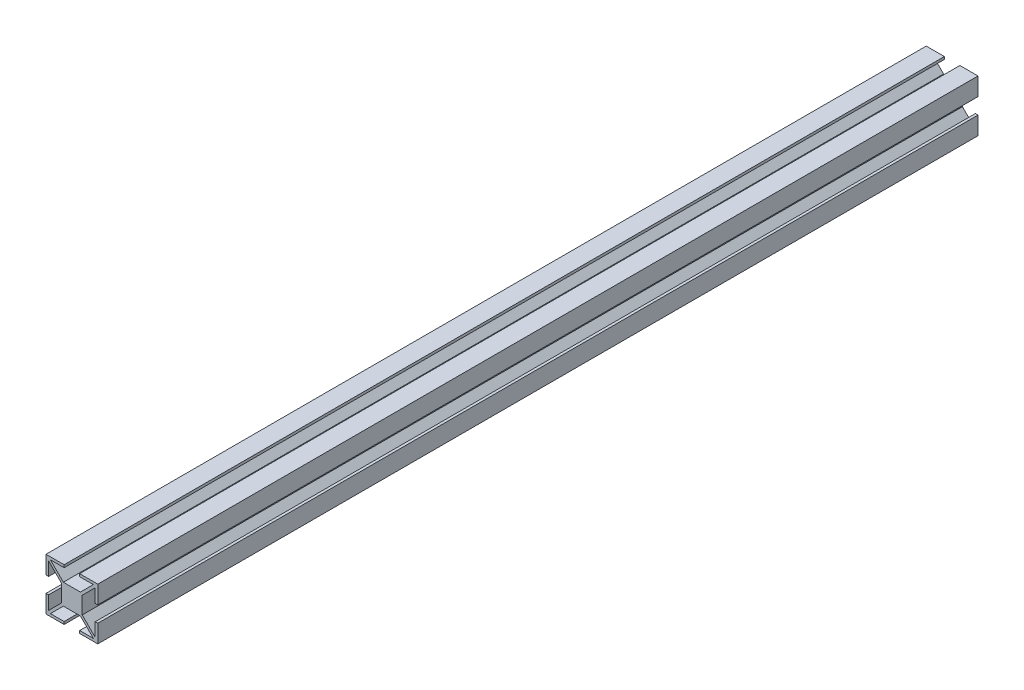
ISO-10303-21;
HEADER;
FILE_DESCRIPTION(('STEP AP214'),'2;1');
FILE_NAME('part.step','',(''),(''),'','','');
FILE_SCHEMA(('AUTOMOTIVE_DESIGN { 1 0 10303 214 1 1 1 1 }'));
ENDSEC;
DATA;
#1=APPLICATION_CONTEXT('core data for automotive mechanical design processes');
#2=APPLICATION_PROTOCOL_DEFINITION('international standard','automotive_design',2000,#1);
#3=PRODUCT_CONTEXT('',#1,'mechanical');
#4=PRODUCT('Part','Part','',(#3));
#5=PRODUCT_RELATED_PRODUCT_CATEGORY('part','',(#4));
#6=PRODUCT_DEFINITION_FORMATION('','',#4);
#7=PRODUCT_DEFINITION_CONTEXT('part definition',#1,'design');
#8=PRODUCT_DEFINITION('design','',#6,#7);
#9=PRODUCT_DEFINITION_SHAPE('','',#8);
#10=(LENGTH_UNIT() NAMED_UNIT(*) SI_UNIT(.MILLI.,.METRE.));
#11=(NAMED_UNIT(*) PLANE_ANGLE_UNIT() SI_UNIT($,.RADIAN.));
#12=(NAMED_UNIT(*) SI_UNIT($,.STERADIAN.) SOLID_ANGLE_UNIT());
#13=UNCERTAINTY_MEASURE_WITH_UNIT(LENGTH_MEASURE(1.E-05),#10,'distance_accuracy_value','');
#14=(GEOMETRIC_REPRESENTATION_CONTEXT(3) GLOBAL_UNCERTAINTY_ASSIGNED_CONTEXT((#13)) GLOBAL_UNIT_ASSIGNED_CONTEXT((#10,
#11,#12)) REPRESENTATION_CONTEXT('',''));
#15=CARTESIAN_POINT('',(0.,0.,0.));
#16=DIRECTION('',(0.,0.,1.));
#17=DIRECTION('',(1.,0.,0.));
#18=AXIS2_PLACEMENT_3D('',#15,#16,#17);
#19=CARTESIAN_POINT('',(10.,10.,340.));
#20=DIRECTION('',(0.,-1.,0.));
#21=DIRECTION('',(0.,0.,-1.));
#22=AXIS2_PLACEMENT_3D('',#19,#20,#21);
#23=PLANE('',#22);
#24=DIRECTION('',(-1.,0.,0.));
#25=VECTOR('',#24,1.);
#26=CARTESIAN_POINT('',(10.,10.,0.));
#27=LINE('',#26,#25);
#28=CARTESIAN_POINT('',(10.,10.,0.));
#29=VERTEX_POINT('',#28);
#30=CARTESIAN_POINT('',(3.,10.,0.));
#31=VERTEX_POINT('',#30);
#32=EDGE_CURVE('E299',#29,#31,#27,.T.);
#33=ORIENTED_EDGE('',*,*,#32,.T.);
#34=DIRECTION('',(0.,0.,-1.));
#35=VECTOR('',#34,1.);
#36=CARTESIAN_POINT('',(3.,10.,340.));
#37=LINE('',#36,#35);
#38=CARTESIAN_POINT('',(3.,10.,340.));
#39=VERTEX_POINT('',#38);
#40=EDGE_CURVE('E11',#39,#31,#37,.T.);
#41=ORIENTED_EDGE('',*,*,#40,.F.);
#42=DIRECTION('',(-1.,0.,0.));
#43=VECTOR('',#42,1.);
#44=CARTESIAN_POINT('',(10.,10.,340.));
#45=LINE('',#44,#43);
#46=CARTESIAN_POINT('',(10.,10.,340.));
#47=VERTEX_POINT('',#46);
#48=EDGE_CURVE('E369',#47,#39,#45,.T.);
#49=ORIENTED_EDGE('',*,*,#48,.F.);
#50=DIRECTION('',(0.,0.,-1.));
#51=VECTOR('',#50,1.);
#52=CARTESIAN_POINT('',(10.,10.,340.));
#53=LINE('',#52,#51);
#54=EDGE_CURVE('E295',#47,#29,#53,.T.);
#55=ORIENTED_EDGE('',*,*,#54,.T.);
#56=EDGE_LOOP('',(#33,#41,#49,#55));
#57=FACE_BOUND('',#56,.T.);
#58=ADVANCED_FACE('F35',(#57),#23,.F.);
#59=CARTESIAN_POINT('',(3.,10.,340.));
#60=DIRECTION('',(1.,0.,0.));
#61=DIRECTION('',(0.,0.,-1.));
#62=AXIS2_PLACEMENT_3D('',#59,#60,#61);
#63=PLANE('',#62);
#64=DIRECTION('',(0.,-1.,0.));
#65=VECTOR('',#64,1.);
#66=CARTESIAN_POINT('',(3.,10.,0.));
#67=LINE('',#66,#65);
#68=CARTESIAN_POINT('',(3.,9.,0.));
#69=VERTEX_POINT('',#68);
#70=EDGE_CURVE('E302',#31,#69,#67,.T.);
#71=ORIENTED_EDGE('',*,*,#70,.T.);
#72=DIRECTION('',(0.,0.,-1.));
#73=VECTOR('',#72,1.);
#74=CARTESIAN_POINT('',(3.,9.,340.));
#75=LINE('',#74,#73);
#76=CARTESIAN_POINT('',(3.,9.,340.));
#77=VERTEX_POINT('',#76);
#78=EDGE_CURVE('E43',#77,#69,#75,.T.);
#79=ORIENTED_EDGE('',*,*,#78,.F.);
#80=DIRECTION('',(0.,-1.,0.));
#81=VECTOR('',#80,1.);
#82=CARTESIAN_POINT('',(3.,10.,340.));
#83=LINE('',#82,#81);
#84=EDGE_CURVE('E178',#39,#77,#83,.T.);
#85=ORIENTED_EDGE('',*,*,#84,.F.);
#86=ORIENTED_EDGE('',*,*,#40,.T.);
#87=EDGE_LOOP('',(#71,#79,#85,#86));
#88=FACE_BOUND('',#87,.T.);
#89=ADVANCED_FACE('F567',(#88),#63,.F.);
#90=CARTESIAN_POINT('',(8.29289321881345,9.,340.));
#91=DIRECTION('',(0.,1.,0.));
#92=DIRECTION('',(0.,0.,1.));
#93=AXIS2_PLACEMENT_3D('',#90,#91,#92);
#94=PLANE('',#93);
#95=DIRECTION('',(1.,0.,0.));
#96=VECTOR('',#95,1.);
#97=CARTESIAN_POINT('',(8.29289321881345,9.,0.));
#98=LINE('',#97,#96);
#99=CARTESIAN_POINT('',(8.29289321881345,9.,0.));
#100=VERTEX_POINT('',#99);
#101=EDGE_CURVE('E304',#69,#100,#98,.T.);
#102=ORIENTED_EDGE('',*,*,#101,.T.);
#103=DIRECTION('',(0.,0.,-1.));
#104=VECTOR('',#103,1.);
#105=CARTESIAN_POINT('',(8.29289321881345,9.,340.));
#106=LINE('',#105,#104);
#107=CARTESIAN_POINT('',(8.29289321881345,9.,340.));
#108=VERTEX_POINT('',#107);
#109=EDGE_CURVE('E460',#108,#100,#106,.T.);
#110=ORIENTED_EDGE('',*,*,#109,.F.);
#111=DIRECTION('',(1.,0.,0.));
#112=VECTOR('',#111,1.);
#113=CARTESIAN_POINT('',(8.29289321881345,9.,340.));
#114=LINE('',#113,#112);
#115=EDGE_CURVE('E468',#77,#108,#114,.T.);
#116=ORIENTED_EDGE('',*,*,#115,.F.);
#117=ORIENTED_EDGE('',*,*,#78,.T.);
#118=EDGE_LOOP('',(#102,#110,#116,#117));
#119=FACE_BOUND('',#118,.T.);
#120=ADVANCED_FACE('F466',(#119),#94,.F.);
#121=CARTESIAN_POINT('',(8.29289321881345,9.,340.));
#122=DIRECTION('',(0.707106781186548,-0.707106781186547,0.));
#123=DIRECTION('',(0.707106781186547,0.707106781186548,0.));
#124=AXIS2_PLACEMENT_3D('',#121,#122,#123);
#125=PLANE('',#124);
#126=DIRECTION('',(-0.707106781186547,-0.707106781186548,0.));
#127=VECTOR('',#126,1.);
#128=CARTESIAN_POINT('',(8.29289321881345,9.,0.));
#129=LINE('',#128,#127);
#130=CARTESIAN_POINT('',(3.29289321881345,4.,0.));
#131=VERTEX_POINT('',#130);
#132=EDGE_CURVE('E306',#100,#131,#129,.T.);
#133=ORIENTED_EDGE('',*,*,#132,.T.);
#134=DIRECTION('',(0.,0.,-1.));
#135=VECTOR('',#134,1.);
#136=CARTESIAN_POINT('',(3.29289321881345,4.,340.));
#137=LINE('',#136,#135);
#138=CARTESIAN_POINT('',(3.29289321881345,4.,340.));
#139=VERTEX_POINT('',#138);
#140=EDGE_CURVE('E457',#139,#131,#137,.T.);
#141=ORIENTED_EDGE('',*,*,#140,.F.);
#142=DIRECTION('',(-0.707106781186547,-0.707106781186548,0.));
#143=VECTOR('',#142,1.);
#144=CARTESIAN_POINT('',(8.29289321881345,9.,340.));
#145=LINE('',#144,#143);
#146=EDGE_CURVE('E486',#108,#139,#145,.T.);
#147=ORIENTED_EDGE('',*,*,#146,.F.);
#148=ORIENTED_EDGE('',*,*,#109,.T.);
#149=EDGE_LOOP('',(#133,#141,#147,#148));
#150=FACE_BOUND('',#149,.T.);
#151=ADVANCED_FACE('F477',(#150),#125,.F.);
#152=CARTESIAN_POINT('',(-3.29289321881345,4.,340.));
#153=DIRECTION('',(0.,-1.,0.));
#154=DIRECTION('',(0.,0.,-1.));
#155=AXIS2_PLACEMENT_3D('',#152,#153,#154);
#156=PLANE('',#155);
#157=DIRECTION('',(-1.,0.,0.));
#158=VECTOR('',#157,1.);
#159=CARTESIAN_POINT('',(-3.29289321881345,4.,0.));
#160=LINE('',#159,#158);
#161=CARTESIAN_POINT('',(-3.29289321881345,4.,0.));
#162=VERTEX_POINT('',#161);
#163=EDGE_CURVE('E308',#131,#162,#160,.T.);
#164=ORIENTED_EDGE('',*,*,#163,.T.);
#165=DIRECTION('',(0.,0.,-1.));
#166=VECTOR('',#165,1.);
#167=CARTESIAN_POINT('',(-3.29289321881345,4.,340.));
#168=LINE('',#167,#166);
#169=CARTESIAN_POINT('',(-3.29289321881345,4.,340.));
#170=VERTEX_POINT('',#169);
#171=EDGE_CURVE('E454',#170,#162,#168,.T.);
#172=ORIENTED_EDGE('',*,*,#171,.F.);
#173=DIRECTION('',(-1.,0.,0.));
#174=VECTOR('',#173,1.);
#175=CARTESIAN_POINT('',(-3.29289321881345,4.,340.));
#176=LINE('',#175,#174);
#177=EDGE_CURVE('E483',#139,#170,#176,.T.);
#178=ORIENTED_EDGE('',*,*,#177,.F.);
#179=ORIENTED_EDGE('',*,*,#140,.T.);
#180=EDGE_LOOP('',(#164,#172,#178,#179));
#181=FACE_BOUND('',#180,.T.);
#182=ADVANCED_FACE('F481',(#181),#156,.F.);
#183=CARTESIAN_POINT('',(-8.29289321881345,9.,340.));
#184=DIRECTION('',(-0.707106781186548,-0.707106781186547,0.));
#185=DIRECTION('',(0.707106781186547,-0.707106781186548,0.));
#186=AXIS2_PLACEMENT_3D('',#183,#184,#185);
#187=PLANE('',#186);
#188=DIRECTION('',(-0.707106781186547,0.707106781186548,0.));
#189=VECTOR('',#188,1.);
#190=CARTESIAN_POINT('',(-8.29289321881345,9.,0.));
#191=LINE('',#190,#189);
#192=CARTESIAN_POINT('',(-8.29289321881345,9.,0.));
#193=VERTEX_POINT('',#192);
#194=EDGE_CURVE('E310',#162,#193,#191,.T.);
#195=ORIENTED_EDGE('',*,*,#194,.T.);
#196=DIRECTION('',(0.,0.,-1.));
#197=VECTOR('',#196,1.);
#198=CARTESIAN_POINT('',(-8.29289321881345,9.,340.));
#199=LINE('',#198,#197);
#200=CARTESIAN_POINT('',(-8.29289321881345,9.,340.));
#201=VERTEX_POINT('',#200);
#202=EDGE_CURVE('E451',#201,#193,#199,.T.);
#203=ORIENTED_EDGE('',*,*,#202,.F.);
#204=DIRECTION('',(-0.707106781186547,0.707106781186548,0.));
#205=VECTOR('',#204,1.);
#206=CARTESIAN_POINT('',(-8.29289321881345,9.,340.));
#207=LINE('',#206,#205);
#208=EDGE_CURVE('E485',#170,#201,#207,.T.);
#209=ORIENTED_EDGE('',*,*,#208,.F.);
#210=ORIENTED_EDGE('',*,*,#171,.T.);
#211=EDGE_LOOP('',(#195,#203,#209,#210));
#212=FACE_BOUND('',#211,.T.);
#213=ADVANCED_FACE('F580',(#212),#187,.F.);
#214=CARTESIAN_POINT('',(-8.29289321881345,9.,340.));
#215=DIRECTION('',(0.,1.,0.));
#216=DIRECTION('',(0.,0.,1.));
#217=AXIS2_PLACEMENT_3D('',#214,#215,#216);
#218=PLANE('',#217);
#219=DIRECTION('',(1.,0.,0.));
#220=VECTOR('',#219,1.);
#221=CARTESIAN_POINT('',(-8.29289321881345,9.,0.));
#222=LINE('',#221,#220);
#223=CARTESIAN_POINT('',(-3.,9.,0.));
#224=VERTEX_POINT('',#223);
#225=EDGE_CURVE('E312',#193,#224,#222,.T.);
#226=ORIENTED_EDGE('',*,*,#225,.T.);
#227=DIRECTION('',(0.,0.,-1.));
#228=VECTOR('',#227,1.);
#229=CARTESIAN_POINT('',(-3.,9.,340.));
#230=LINE('',#229,#228);
#231=CARTESIAN_POINT('',(-3.,9.,340.));
#232=VERTEX_POINT('',#231);
#233=EDGE_CURVE('E448',#232,#224,#230,.T.);
#234=ORIENTED_EDGE('',*,*,#233,.F.);
#235=DIRECTION('',(1.,0.,0.));
#236=VECTOR('',#235,1.);
#237=CARTESIAN_POINT('',(-8.29289321881345,9.,340.));
#238=LINE('',#237,#236);
#239=EDGE_CURVE('E488',#201,#232,#238,.T.);
#240=ORIENTED_EDGE('',*,*,#239,.F.);
#241=ORIENTED_EDGE('',*,*,#202,.T.);
#242=EDGE_LOOP('',(#226,#234,#240,#241));
#243=FACE_BOUND('',#242,.T.);
#244=ADVANCED_FACE('F583',(#243),#218,.F.);
#245=CARTESIAN_POINT('',(-3.,10.,340.));
#246=DIRECTION('',(-1.,0.,0.));
#247=DIRECTION('',(0.,0.,1.));
#248=AXIS2_PLACEMENT_3D('',#245,#246,#247);
#249=PLANE('',#248);
#250=DIRECTION('',(0.,1.,0.));
#251=VECTOR('',#250,1.);
#252=CARTESIAN_POINT('',(-3.,10.,0.));
#253=LINE('',#252,#251);
#254=CARTESIAN_POINT('',(-3.,10.,0.));
#255=VERTEX_POINT('',#254);
#256=EDGE_CURVE('E314',#224,#255,#253,.T.);
#257=ORIENTED_EDGE('',*,*,#256,.T.);
#258=DIRECTION('',(0.,0.,-1.));
#259=VECTOR('',#258,1.);
#260=CARTESIAN_POINT('',(-3.,10.,340.));
#261=LINE('',#260,#259);
#262=CARTESIAN_POINT('',(-3.,10.,340.));
#263=VERTEX_POINT('',#262);
#264=EDGE_CURVE('E445',#263,#255,#261,.T.);
#265=ORIENTED_EDGE('',*,*,#264,.F.);
#266=DIRECTION('',(0.,1.,0.));
#267=VECTOR('',#266,1.);
#268=CARTESIAN_POINT('',(-3.,10.,340.));
#269=LINE('',#268,#267);
#270=EDGE_CURVE('E494',#232,#263,#269,.T.);
#271=ORIENTED_EDGE('',*,*,#270,.F.);
#272=ORIENTED_EDGE('',*,*,#233,.T.);
#273=EDGE_LOOP('',(#257,#265,#271,#272));
#274=FACE_BOUND('',#273,.T.);
#275=ADVANCED_FACE('F587',(#274),#249,.F.);
#276=CARTESIAN_POINT('',(-10.,10.,340.));
#277=DIRECTION('',(0.,-1.,0.));
#278=DIRECTION('',(0.,0.,-1.));
#279=AXIS2_PLACEMENT_3D('',#276,#277,#278);
#280=PLANE('',#279);
#281=DIRECTION('',(-1.,0.,0.));
#282=VECTOR('',#281,1.);
#283=CARTESIAN_POINT('',(-10.,10.,0.));
#284=LINE('',#283,#282);
#285=CARTESIAN_POINT('',(-10.,10.,0.));
#286=VERTEX_POINT('',#285);
#287=EDGE_CURVE('E316',#255,#286,#284,.T.);
#288=ORIENTED_EDGE('',*,*,#287,.T.);
#289=DIRECTION('',(0.,0.,-1.));
#290=VECTOR('',#289,1.);
#291=CARTESIAN_POINT('',(-10.,10.,340.));
#292=LINE('',#291,#290);
#293=CARTESIAN_POINT('',(-10.,10.,340.));
#294=VERTEX_POINT('',#293);
#295=EDGE_CURVE('E442',#294,#286,#292,.T.);
#296=ORIENTED_EDGE('',*,*,#295,.F.);
#297=DIRECTION('',(-1.,0.,0.));
#298=VECTOR('',#297,1.);
#299=CARTESIAN_POINT('',(-10.,10.,340.));
#300=LINE('',#299,#298);
#301=EDGE_CURVE('E496',#263,#294,#300,.T.);
#302=ORIENTED_EDGE('',*,*,#301,.F.);
#303=ORIENTED_EDGE('',*,*,#264,.T.);
#304=EDGE_LOOP('',(#288,#296,#302,#303));
#305=FACE_BOUND('',#304,.T.);
#306=ADVANCED_FACE('F591',(#305),#280,.F.);
#307=CARTESIAN_POINT('',(-10.,10.,340.));
#308=DIRECTION('',(1.,0.,0.));
#309=DIRECTION('',(0.,0.,-1.));
#310=AXIS2_PLACEMENT_3D('',#307,#308,#309);
#311=PLANE('',#310);
#312=DIRECTION('',(0.,-1.,0.));
#313=VECTOR('',#312,1.);
#314=CARTESIAN_POINT('',(-10.,10.,0.));
#315=LINE('',#314,#313);
#316=CARTESIAN_POINT('',(-10.,3.07404458598726,0.));
#317=VERTEX_POINT('',#316);
#318=EDGE_CURVE('E318',#286,#317,#315,.T.);
#319=ORIENTED_EDGE('',*,*,#318,.T.);
#320=DIRECTION('',(0.,0.,-1.));
#321=VECTOR('',#320,1.);
#322=CARTESIAN_POINT('',(-10.,3.07404458598726,340.));
#323=LINE('',#322,#321);
#324=CARTESIAN_POINT('',(-10.,3.07404458598726,340.));
#325=VERTEX_POINT('',#324);
#326=EDGE_CURVE('E439',#325,#317,#323,.T.);
#327=ORIENTED_EDGE('',*,*,#326,.F.);
#328=DIRECTION('',(0.,-1.,0.));
#329=VECTOR('',#328,1.);
#330=CARTESIAN_POINT('',(-10.,10.,340.));
#331=LINE('',#330,#329);
#332=EDGE_CURVE('E498',#294,#325,#331,.T.);
#333=ORIENTED_EDGE('',*,*,#332,.F.);
#334=ORIENTED_EDGE('',*,*,#295,.T.);
#335=EDGE_LOOP('',(#319,#327,#333,#334));
#336=FACE_BOUND('',#335,.T.);
#337=ADVANCED_FACE('F595',(#336),#311,.F.);
#338=CARTESIAN_POINT('',(-10.,3.07404458598726,340.));
#339=DIRECTION('',(0.,1.,0.));
#340=DIRECTION('',(0.,0.,1.));
#341=AXIS2_PLACEMENT_3D('',#338,#339,#340);
#342=PLANE('',#341);
#343=DIRECTION('',(1.,0.,0.));
#344=VECTOR('',#343,1.);
#345=CARTESIAN_POINT('',(-10.,3.07404458598726,0.));
#346=LINE('',#345,#344);
#347=CARTESIAN_POINT('',(-9.,3.07404458598726,0.));
#348=VERTEX_POINT('',#347);
#349=EDGE_CURVE('E320',#317,#348,#346,.T.);
#350=ORIENTED_EDGE('',*,*,#349,.T.);
#351=DIRECTION('',(0.,0.,-1.));
#352=VECTOR('',#351,1.);
#353=CARTESIAN_POINT('',(-9.,3.07404458598726,340.));
#354=LINE('',#353,#352);
#355=CARTESIAN_POINT('',(-9.,3.07404458598726,340.));
#356=VERTEX_POINT('',#355);
#357=EDGE_CURVE('E436',#356,#348,#354,.T.);
#358=ORIENTED_EDGE('',*,*,#357,.F.);
#359=DIRECTION('',(1.,0.,0.));
#360=VECTOR('',#359,1.);
#361=CARTESIAN_POINT('',(-10.,3.07404458598726,340.));
#362=LINE('',#361,#360);
#363=EDGE_CURVE('E500',#325,#356,#362,.T.);
#364=ORIENTED_EDGE('',*,*,#363,.F.);
#365=ORIENTED_EDGE('',*,*,#326,.T.);
#366=EDGE_LOOP('',(#350,#358,#364,#365));
#367=FACE_BOUND('',#366,.T.);
#368=ADVANCED_FACE('F599',(#367),#342,.F.);
#369=CARTESIAN_POINT('',(-9.,8.29289321881345,340.));
#370=DIRECTION('',(-1.,0.,0.));
#371=DIRECTION('',(0.,0.,1.));
#372=AXIS2_PLACEMENT_3D('',#369,#370,#371);
#373=PLANE('',#372);
#374=DIRECTION('',(0.,1.,0.));
#375=VECTOR('',#374,1.);
#376=CARTESIAN_POINT('',(-9.,8.29289321881345,0.));
#377=LINE('',#376,#375);
#378=CARTESIAN_POINT('',(-9.,8.29289321881345,0.));
#379=VERTEX_POINT('',#378);
#380=EDGE_CURVE('E322',#348,#379,#377,.T.);
#381=ORIENTED_EDGE('',*,*,#380,.T.);
#382=DIRECTION('',(0.,0.,-1.));
#383=VECTOR('',#382,1.);
#384=CARTESIAN_POINT('',(-9.,8.29289321881345,340.));
#385=LINE('',#384,#383);
#386=CARTESIAN_POINT('',(-9.,8.29289321881345,340.));
#387=VERTEX_POINT('',#386);
#388=EDGE_CURVE('E433',#387,#379,#385,.T.);
#389=ORIENTED_EDGE('',*,*,#388,.F.);
#390=DIRECTION('',(0.,1.,0.));
#391=VECTOR('',#390,1.);
#392=CARTESIAN_POINT('',(-9.,8.29289321881345,340.));
#393=LINE('',#392,#391);
#394=EDGE_CURVE('E502',#356,#387,#393,.T.);
#395=ORIENTED_EDGE('',*,*,#394,.F.);
#396=ORIENTED_EDGE('',*,*,#357,.T.);
#397=EDGE_LOOP('',(#381,#389,#395,#396));
#398=FACE_BOUND('',#397,.T.);
#399=ADVANCED_FACE('F603',(#398),#373,.F.);
#400=CARTESIAN_POINT('',(-9.,8.29289321881345,340.));
#401=DIRECTION('',(0.707106781186547,0.707106781186547,0.));
#402=DIRECTION('',(-0.707106781186548,0.707106781186548,0.));
#403=AXIS2_PLACEMENT_3D('',#400,#401,#402);
#404=PLANE('',#403);
#405=DIRECTION('',(0.707106781186547,-0.707106781186547,0.));
#406=VECTOR('',#405,1.);
#407=CARTESIAN_POINT('',(-9.,8.29289321881345,0.));
#408=LINE('',#407,#406);
#409=CARTESIAN_POINT('',(-4.,3.29289321881345,0.));
#410=VERTEX_POINT('',#409);
#411=EDGE_CURVE('E324',#379,#410,#408,.T.);
#412=ORIENTED_EDGE('',*,*,#411,.T.);
#413=DIRECTION('',(0.,0.,-1.));
#414=VECTOR('',#413,1.);
#415=CARTESIAN_POINT('',(-4.,3.29289321881345,340.));
#416=LINE('',#415,#414);
#417=CARTESIAN_POINT('',(-4.,3.29289321881345,340.));
#418=VERTEX_POINT('',#417);
#419=EDGE_CURVE('E430',#418,#410,#416,.T.);
#420=ORIENTED_EDGE('',*,*,#419,.F.);
#421=DIRECTION('',(0.707106781186547,-0.707106781186547,0.));
#422=VECTOR('',#421,1.);
#423=CARTESIAN_POINT('',(-9.,8.29289321881345,340.));
#424=LINE('',#423,#422);
#425=EDGE_CURVE('E504',#387,#418,#424,.T.);
#426=ORIENTED_EDGE('',*,*,#425,.F.);
#427=ORIENTED_EDGE('',*,*,#388,.T.);
#428=EDGE_LOOP('',(#412,#420,#426,#427));
#429=FACE_BOUND('',#428,.T.);
#430=ADVANCED_FACE('F607',(#429),#404,.F.);
#431=CARTESIAN_POINT('',(-4.,-3.29289321881345,340.));
#432=DIRECTION('',(1.,0.,0.));
#433=DIRECTION('',(0.,0.,-1.));
#434=AXIS2_PLACEMENT_3D('',#431,#432,#433);
#435=PLANE('',#434);
#436=DIRECTION('',(0.,-1.,0.));
#437=VECTOR('',#436,1.);
#438=CARTESIAN_POINT('',(-4.,-3.29289321881345,0.));
#439=LINE('',#438,#437);
#440=CARTESIAN_POINT('',(-4.,-3.29289321881345,0.));
#441=VERTEX_POINT('',#440);
#442=EDGE_CURVE('E326',#410,#441,#439,.T.);
#443=ORIENTED_EDGE('',*,*,#442,.T.);
#444=DIRECTION('',(0.,0.,-1.));
#445=VECTOR('',#444,1.);
#446=CARTESIAN_POINT('',(-4.,-3.29289321881345,340.));
#447=LINE('',#446,#445);
#448=CARTESIAN_POINT('',(-4.,-3.29289321881345,340.));
#449=VERTEX_POINT('',#448);
#450=EDGE_CURVE('E427',#449,#441,#447,.T.);
#451=ORIENTED_EDGE('',*,*,#450,.F.);
#452=DIRECTION('',(0.,-1.,0.));
#453=VECTOR('',#452,1.);
#454=CARTESIAN_POINT('',(-4.,-3.29289321881345,340.));
#455=LINE('',#454,#453);
#456=EDGE_CURVE('E506',#418,#449,#455,.T.);
#457=ORIENTED_EDGE('',*,*,#456,.F.);
#458=ORIENTED_EDGE('',*,*,#419,.T.);
#459=EDGE_LOOP('',(#443,#451,#457,#458));
#460=FACE_BOUND('',#459,.T.);
#461=ADVANCED_FACE('F611',(#460),#435,.F.);
#462=CARTESIAN_POINT('',(-9.,-8.29289321881345,340.));
#463=DIRECTION('',(0.707106781186547,-0.707106781186547,0.));
#464=DIRECTION('',(0.707106781186548,0.707106781186548,0.));
#465=AXIS2_PLACEMENT_3D('',#462,#463,#464);
#466=PLANE('',#465);
#467=DIRECTION('',(-0.707106781186547,-0.707106781186547,0.));
#468=VECTOR('',#467,1.);
#469=CARTESIAN_POINT('',(-9.,-8.29289321881345,0.));
#470=LINE('',#469,#468);
#471=CARTESIAN_POINT('',(-9.,-8.29289321881345,0.));
#472=VERTEX_POINT('',#471);
#473=EDGE_CURVE('E328',#441,#472,#470,.T.);
#474=ORIENTED_EDGE('',*,*,#473,.T.);
#475=DIRECTION('',(0.,0.,-1.));
#476=VECTOR('',#475,1.);
#477=CARTESIAN_POINT('',(-9.,-8.29289321881345,340.));
#478=LINE('',#477,#476);
#479=CARTESIAN_POINT('',(-9.,-8.29289321881345,340.));
#480=VERTEX_POINT('',#479);
#481=EDGE_CURVE('E424',#480,#472,#478,.T.);
#482=ORIENTED_EDGE('',*,*,#481,.F.);
#483=DIRECTION('',(-0.707106781186547,-0.707106781186547,0.));
#484=VECTOR('',#483,1.);
#485=CARTESIAN_POINT('',(-9.,-8.29289321881345,340.));
#486=LINE('',#485,#484);
#487=EDGE_CURVE('E508',#449,#480,#486,.T.);
#488=ORIENTED_EDGE('',*,*,#487,.F.);
#489=ORIENTED_EDGE('',*,*,#450,.T.);
#490=EDGE_LOOP('',(#474,#482,#488,#489));
#491=FACE_BOUND('',#490,.T.);
#492=ADVANCED_FACE('F615',(#491),#466,.F.);
#493=CARTESIAN_POINT('',(-9.,-8.29289321881345,340.));
#494=DIRECTION('',(-1.,0.,0.));
#495=DIRECTION('',(0.,0.,1.));
#496=AXIS2_PLACEMENT_3D('',#493,#494,#495);
#497=PLANE('',#496);
#498=DIRECTION('',(0.,1.,0.));
#499=VECTOR('',#498,1.);
#500=CARTESIAN_POINT('',(-9.,-8.29289321881345,0.));
#501=LINE('',#500,#499);
#502=CARTESIAN_POINT('',(-9.,-3.07404458598726,0.));
#503=VERTEX_POINT('',#502);
#504=EDGE_CURVE('E330',#472,#503,#501,.T.);
#505=ORIENTED_EDGE('',*,*,#504,.T.);
#506=DIRECTION('',(0.,0.,-1.));
#507=VECTOR('',#506,1.);
#508=CARTESIAN_POINT('',(-9.,-3.07404458598726,340.));
#509=LINE('',#508,#507);
#510=CARTESIAN_POINT('',(-9.,-3.07404458598726,340.));
#511=VERTEX_POINT('',#510);
#512=EDGE_CURVE('E421',#511,#503,#509,.T.);
#513=ORIENTED_EDGE('',*,*,#512,.F.);
#514=DIRECTION('',(0.,1.,0.));
#515=VECTOR('',#514,1.);
#516=CARTESIAN_POINT('',(-9.,-8.29289321881345,340.));
#517=LINE('',#516,#515);
#518=EDGE_CURVE('E510',#480,#511,#517,.T.);
#519=ORIENTED_EDGE('',*,*,#518,.F.);
#520=ORIENTED_EDGE('',*,*,#481,.T.);
#521=EDGE_LOOP('',(#505,#513,#519,#520));
#522=FACE_BOUND('',#521,.T.);
#523=ADVANCED_FACE('F619',(#522),#497,.F.);
#524=CARTESIAN_POINT('',(-10.,-3.07404458598726,340.));
#525=DIRECTION('',(0.,-1.,0.));
#526=DIRECTION('',(0.,0.,-1.));
#527=AXIS2_PLACEMENT_3D('',#524,#525,#526);
#528=PLANE('',#527);
#529=DIRECTION('',(-1.,0.,0.));
#530=VECTOR('',#529,1.);
#531=CARTESIAN_POINT('',(-10.,-3.07404458598726,0.));
#532=LINE('',#531,#530);
#533=CARTESIAN_POINT('',(-10.,-3.07404458598726,0.));
#534=VERTEX_POINT('',#533);
#535=EDGE_CURVE('E332',#503,#534,#532,.T.);
#536=ORIENTED_EDGE('',*,*,#535,.T.);
#537=DIRECTION('',(0.,0.,-1.));
#538=VECTOR('',#537,1.);
#539=CARTESIAN_POINT('',(-10.,-3.07404458598726,340.));
#540=LINE('',#539,#538);
#541=CARTESIAN_POINT('',(-10.,-3.07404458598726,340.));
#542=VERTEX_POINT('',#541);
#543=EDGE_CURVE('E418',#542,#534,#540,.T.);
#544=ORIENTED_EDGE('',*,*,#543,.F.);
#545=DIRECTION('',(-1.,0.,0.));
#546=VECTOR('',#545,1.);
#547=CARTESIAN_POINT('',(-10.,-3.07404458598726,340.));
#548=LINE('',#547,#546);
#549=EDGE_CURVE('E512',#511,#542,#548,.T.);
#550=ORIENTED_EDGE('',*,*,#549,.F.);
#551=ORIENTED_EDGE('',*,*,#512,.T.);
#552=EDGE_LOOP('',(#536,#544,#550,#551));
#553=FACE_BOUND('',#552,.T.);
#554=ADVANCED_FACE('F623',(#553),#528,.F.);
#555=CARTESIAN_POINT('',(-10.,-10.,340.));
#556=DIRECTION('',(1.,0.,0.));
#557=DIRECTION('',(0.,0.,-1.));
#558=AXIS2_PLACEMENT_3D('',#555,#556,#557);
#559=PLANE('',#558);
#560=DIRECTION('',(0.,-1.,0.));
#561=VECTOR('',#560,1.);
#562=CARTESIAN_POINT('',(-10.,-10.,0.));
#563=LINE('',#562,#561);
#564=CARTESIAN_POINT('',(-10.,-10.,0.));
#565=VERTEX_POINT('',#564);
#566=EDGE_CURVE('E334',#534,#565,#563,.T.);
#567=ORIENTED_EDGE('',*,*,#566,.T.);
#568=DIRECTION('',(0.,0.,-1.));
#569=VECTOR('',#568,1.);
#570=CARTESIAN_POINT('',(-10.,-10.,340.));
#571=LINE('',#570,#569);
#572=CARTESIAN_POINT('',(-10.,-10.,340.));
#573=VERTEX_POINT('',#572);
#574=EDGE_CURVE('E415',#573,#565,#571,.T.);
#575=ORIENTED_EDGE('',*,*,#574,.F.);
#576=DIRECTION('',(0.,-1.,0.));
#577=VECTOR('',#576,1.);
#578=CARTESIAN_POINT('',(-10.,-10.,340.));
#579=LINE('',#578,#577);
#580=EDGE_CURVE('E514',#542,#573,#579,.T.);
#581=ORIENTED_EDGE('',*,*,#580,.F.);
#582=ORIENTED_EDGE('',*,*,#543,.T.);
#583=EDGE_LOOP('',(#567,#575,#581,#582));
#584=FACE_BOUND('',#583,.T.);
#585=ADVANCED_FACE('F627',(#584),#559,.F.);
#586=CARTESIAN_POINT('',(-10.,-10.,340.));
#587=DIRECTION('',(0.,1.,0.));
#588=DIRECTION('',(-1.,0.,0.));
#589=AXIS2_PLACEMENT_3D('',#586,#587,#588);
#590=PLANE('',#589);
#591=DIRECTION('',(1.,0.,0.));
#592=VECTOR('',#591,1.);
#593=CARTESIAN_POINT('',(-10.,-10.,0.));
#594=LINE('',#593,#592);
#595=CARTESIAN_POINT('',(-3.,-10.,0.));
#596=VERTEX_POINT('',#595);
#597=EDGE_CURVE('E336',#565,#596,#594,.T.);
#598=ORIENTED_EDGE('',*,*,#597,.T.);
#599=DIRECTION('',(0.,0.,-1.));
#600=VECTOR('',#599,1.);
#601=CARTESIAN_POINT('',(-3.,-10.,340.));
#602=LINE('',#601,#600);
#603=CARTESIAN_POINT('',(-3.,-10.,340.));
#604=VERTEX_POINT('',#603);
#605=EDGE_CURVE('E412',#604,#596,#602,.T.);
#606=ORIENTED_EDGE('',*,*,#605,.F.);
#607=DIRECTION('',(1.,0.,0.));
#608=VECTOR('',#607,1.);
#609=CARTESIAN_POINT('',(-10.,-10.,340.));
#610=LINE('',#609,#608);
#611=EDGE_CURVE('E516',#573,#604,#610,.T.);
#612=ORIENTED_EDGE('',*,*,#611,.F.);
#613=ORIENTED_EDGE('',*,*,#574,.T.);
#614=EDGE_LOOP('',(#598,#606,#612,#613));
#615=FACE_BOUND('',#614,.T.);
#616=ADVANCED_FACE('F631',(#615),#590,.F.);
#617=CARTESIAN_POINT('',(-3.,-10.,340.));
#618=DIRECTION('',(-1.,0.,0.));
#619=DIRECTION('',(0.,0.,1.));
#620=AXIS2_PLACEMENT_3D('',#617,#618,#619);
#621=PLANE('',#620);
#622=DIRECTION('',(0.,1.,0.));
#623=VECTOR('',#622,1.);
#624=CARTESIAN_POINT('',(-3.,-10.,0.));
#625=LINE('',#624,#623);
#626=CARTESIAN_POINT('',(-3.,-9.,0.));
#627=VERTEX_POINT('',#626);
#628=EDGE_CURVE('E338',#596,#627,#625,.T.);
#629=ORIENTED_EDGE('',*,*,#628,.T.);
#630=DIRECTION('',(0.,0.,-1.));
#631=VECTOR('',#630,1.);
#632=CARTESIAN_POINT('',(-3.,-9.,340.));
#633=LINE('',#632,#631);
#634=CARTESIAN_POINT('',(-3.,-9.,340.));
#635=VERTEX_POINT('',#634);
#636=EDGE_CURVE('E409',#635,#627,#633,.T.);
#637=ORIENTED_EDGE('',*,*,#636,.F.);
#638=DIRECTION('',(0.,1.,0.));
#639=VECTOR('',#638,1.);
#640=CARTESIAN_POINT('',(-3.,-10.,340.));
#641=LINE('',#640,#639);
#642=EDGE_CURVE('E518',#604,#635,#641,.T.);
#643=ORIENTED_EDGE('',*,*,#642,.F.);
#644=ORIENTED_EDGE('',*,*,#605,.T.);
#645=EDGE_LOOP('',(#629,#637,#643,#644));
#646=FACE_BOUND('',#645,.T.);
#647=ADVANCED_FACE('F635',(#646),#621,.F.);
#648=CARTESIAN_POINT('',(-8.29289321881345,-9.,340.));
#649=DIRECTION('',(0.,-1.,0.));
#650=DIRECTION('',(0.,0.,-1.));
#651=AXIS2_PLACEMENT_3D('',#648,#649,#650);
#652=PLANE('',#651);
#653=DIRECTION('',(-1.,0.,0.));
#654=VECTOR('',#653,1.);
#655=CARTESIAN_POINT('',(-8.29289321881345,-9.,0.));
#656=LINE('',#655,#654);
#657=CARTESIAN_POINT('',(-8.29289321881345,-9.,0.));
#658=VERTEX_POINT('',#657);
#659=EDGE_CURVE('E340',#627,#658,#656,.T.);
#660=ORIENTED_EDGE('',*,*,#659,.T.);
#661=DIRECTION('',(0.,0.,-1.));
#662=VECTOR('',#661,1.);
#663=CARTESIAN_POINT('',(-8.29289321881345,-9.,340.));
#664=LINE('',#663,#662);
#665=CARTESIAN_POINT('',(-8.29289321881345,-9.,340.));
#666=VERTEX_POINT('',#665);
#667=EDGE_CURVE('E406',#666,#658,#664,.T.);
#668=ORIENTED_EDGE('',*,*,#667,.F.);
#669=DIRECTION('',(-1.,0.,0.));
#670=VECTOR('',#669,1.);
#671=CARTESIAN_POINT('',(-8.29289321881345,-9.,340.));
#672=LINE('',#671,#670);
#673=EDGE_CURVE('E520',#635,#666,#672,.T.);
#674=ORIENTED_EDGE('',*,*,#673,.F.);
#675=ORIENTED_EDGE('',*,*,#636,.T.);
#676=EDGE_LOOP('',(#660,#668,#674,#675));
#677=FACE_BOUND('',#676,.T.);
#678=ADVANCED_FACE('F639',(#677),#652,.F.);
#679=CARTESIAN_POINT('',(-8.29289321881345,-9.,340.));
#680=DIRECTION('',(-0.707106781186548,0.707106781186547,0.));
#681=DIRECTION('',(-0.707106781186547,-0.707106781186548,0.));
#682=AXIS2_PLACEMENT_3D('',#679,#680,#681);
#683=PLANE('',#682);
#684=DIRECTION('',(0.707106781186547,0.707106781186548,0.));
#685=VECTOR('',#684,1.);
#686=CARTESIAN_POINT('',(-8.29289321881345,-9.,0.));
#687=LINE('',#686,#685);
#688=CARTESIAN_POINT('',(-3.29289321881345,-4.,0.));
#689=VERTEX_POINT('',#688);
#690=EDGE_CURVE('E342',#658,#689,#687,.T.);
#691=ORIENTED_EDGE('',*,*,#690,.T.);
#692=DIRECTION('',(0.,0.,-1.));
#693=VECTOR('',#692,1.);
#694=CARTESIAN_POINT('',(-3.29289321881345,-4.,340.));
#695=LINE('',#694,#693);
#696=CARTESIAN_POINT('',(-3.29289321881345,-4.,340.));
#697=VERTEX_POINT('',#696);
#698=EDGE_CURVE('E403',#697,#689,#695,.T.);
#699=ORIENTED_EDGE('',*,*,#698,.F.);
#700=DIRECTION('',(0.707106781186547,0.707106781186548,0.));
#701=VECTOR('',#700,1.);
#702=CARTESIAN_POINT('',(-8.29289321881345,-9.,340.));
#703=LINE('',#702,#701);
#704=EDGE_CURVE('E522',#666,#697,#703,.T.);
#705=ORIENTED_EDGE('',*,*,#704,.F.);
#706=ORIENTED_EDGE('',*,*,#667,.T.);
#707=EDGE_LOOP('',(#691,#699,#705,#706));
#708=FACE_BOUND('',#707,.T.);
#709=ADVANCED_FACE('F643',(#708),#683,.F.);
#710=CARTESIAN_POINT('',(-3.29289321881345,-4.,340.));
#711=DIRECTION('',(0.,1.,0.));
#712=DIRECTION('',(0.,0.,1.));
#713=AXIS2_PLACEMENT_3D('',#710,#711,#712);
#714=PLANE('',#713);
#715=DIRECTION('',(1.,0.,0.));
#716=VECTOR('',#715,1.);
#717=CARTESIAN_POINT('',(-3.29289321881345,-4.,0.));
#718=LINE('',#717,#716);
#719=CARTESIAN_POINT('',(3.29289321881345,-4.,0.));
#720=VERTEX_POINT('',#719);
#721=EDGE_CURVE('E344',#689,#720,#718,.T.);
#722=ORIENTED_EDGE('',*,*,#721,.T.);
#723=DIRECTION('',(0.,0.,-1.));
#724=VECTOR('',#723,1.);
#725=CARTESIAN_POINT('',(3.29289321881345,-4.,340.));
#726=LINE('',#725,#724);
#727=CARTESIAN_POINT('',(3.29289321881345,-4.,340.));
#728=VERTEX_POINT('',#727);
#729=EDGE_CURVE('E400',#728,#720,#726,.T.);
#730=ORIENTED_EDGE('',*,*,#729,.F.);
#731=DIRECTION('',(1.,0.,0.));
#732=VECTOR('',#731,1.);
#733=CARTESIAN_POINT('',(-3.29289321881345,-4.,340.));
#734=LINE('',#733,#732);
#735=EDGE_CURVE('E524',#697,#728,#734,.T.);
#736=ORIENTED_EDGE('',*,*,#735,.F.);
#737=ORIENTED_EDGE('',*,*,#698,.T.);
#738=EDGE_LOOP('',(#722,#730,#736,#737));
#739=FACE_BOUND('',#738,.T.);
#740=ADVANCED_FACE('F647',(#739),#714,.F.);
#741=CARTESIAN_POINT('',(8.29289321881345,-9.,340.));
#742=DIRECTION('',(0.707106781186548,0.707106781186547,0.));
#743=DIRECTION('',(-0.707106781186547,0.707106781186548,0.));
#744=AXIS2_PLACEMENT_3D('',#741,#742,#743);
#745=PLANE('',#744);
#746=DIRECTION('',(0.707106781186547,-0.707106781186548,0.));
#747=VECTOR('',#746,1.);
#748=CARTESIAN_POINT('',(8.29289321881345,-9.,0.));
#749=LINE('',#748,#747);
#750=CARTESIAN_POINT('',(8.29289321881345,-9.,0.));
#751=VERTEX_POINT('',#750);
#752=EDGE_CURVE('E346',#720,#751,#749,.T.);
#753=ORIENTED_EDGE('',*,*,#752,.T.);
#754=DIRECTION('',(0.,0.,-1.));
#755=VECTOR('',#754,1.);
#756=CARTESIAN_POINT('',(8.29289321881345,-9.,340.));
#757=LINE('',#756,#755);
#758=CARTESIAN_POINT('',(8.29289321881345,-9.,340.));
#759=VERTEX_POINT('',#758);
#760=EDGE_CURVE('E397',#759,#751,#757,.T.);
#761=ORIENTED_EDGE('',*,*,#760,.F.);
#762=DIRECTION('',(0.707106781186547,-0.707106781186548,0.));
#763=VECTOR('',#762,1.);
#764=CARTESIAN_POINT('',(8.29289321881345,-9.,340.));
#765=LINE('',#764,#763);
#766=EDGE_CURVE('E526',#728,#759,#765,.T.);
#767=ORIENTED_EDGE('',*,*,#766,.F.);
#768=ORIENTED_EDGE('',*,*,#729,.T.);
#769=EDGE_LOOP('',(#753,#761,#767,#768));
#770=FACE_BOUND('',#769,.T.);
#771=ADVANCED_FACE('F651',(#770),#745,.F.);
#772=CARTESIAN_POINT('',(8.29289321881345,-9.,340.));
#773=DIRECTION('',(0.,-1.,0.));
#774=DIRECTION('',(0.,0.,-1.));
#775=AXIS2_PLACEMENT_3D('',#772,#773,#774);
#776=PLANE('',#775);
#777=DIRECTION('',(-1.,0.,0.));
#778=VECTOR('',#777,1.);
#779=CARTESIAN_POINT('',(8.29289321881345,-9.,0.));
#780=LINE('',#779,#778);
#781=CARTESIAN_POINT('',(3.,-9.,0.));
#782=VERTEX_POINT('',#781);
#783=EDGE_CURVE('E348',#751,#782,#780,.T.);
#784=ORIENTED_EDGE('',*,*,#783,.T.);
#785=DIRECTION('',(0.,0.,-1.));
#786=VECTOR('',#785,1.);
#787=CARTESIAN_POINT('',(3.,-9.,340.));
#788=LINE('',#787,#786);
#789=CARTESIAN_POINT('',(3.,-9.,340.));
#790=VERTEX_POINT('',#789);
#791=EDGE_CURVE('E394',#790,#782,#788,.T.);
#792=ORIENTED_EDGE('',*,*,#791,.F.);
#793=DIRECTION('',(-1.,0.,0.));
#794=VECTOR('',#793,1.);
#795=CARTESIAN_POINT('',(8.29289321881345,-9.,340.));
#796=LINE('',#795,#794);
#797=EDGE_CURVE('E528',#759,#790,#796,.T.);
#798=ORIENTED_EDGE('',*,*,#797,.F.);
#799=ORIENTED_EDGE('',*,*,#760,.T.);
#800=EDGE_LOOP('',(#784,#792,#798,#799));
#801=FACE_BOUND('',#800,.T.);
#802=ADVANCED_FACE('F655',(#801),#776,.F.);
#803=CARTESIAN_POINT('',(3.,-10.,340.));
#804=DIRECTION('',(1.,0.,0.));
#805=DIRECTION('',(0.,0.,-1.));
#806=AXIS2_PLACEMENT_3D('',#803,#804,#805);
#807=PLANE('',#806);
#808=DIRECTION('',(0.,-1.,0.));
#809=VECTOR('',#808,1.);
#810=CARTESIAN_POINT('',(3.,-10.,0.));
#811=LINE('',#810,#809);
#812=CARTESIAN_POINT('',(3.,-10.,0.));
#813=VERTEX_POINT('',#812);
#814=EDGE_CURVE('E350',#782,#813,#811,.T.);
#815=ORIENTED_EDGE('',*,*,#814,.T.);
#816=DIRECTION('',(0.,0.,-1.));
#817=VECTOR('',#816,1.);
#818=CARTESIAN_POINT('',(3.,-10.,340.));
#819=LINE('',#818,#817);
#820=CARTESIAN_POINT('',(3.,-10.,340.));
#821=VERTEX_POINT('',#820);
#822=EDGE_CURVE('E391',#821,#813,#819,.T.);
#823=ORIENTED_EDGE('',*,*,#822,.F.);
#824=DIRECTION('',(0.,-1.,0.));
#825=VECTOR('',#824,1.);
#826=CARTESIAN_POINT('',(3.,-10.,340.));
#827=LINE('',#826,#825);
#828=EDGE_CURVE('E530',#790,#821,#827,.T.);
#829=ORIENTED_EDGE('',*,*,#828,.F.);
#830=ORIENTED_EDGE('',*,*,#791,.T.);
#831=EDGE_LOOP('',(#815,#823,#829,#830));
#832=FACE_BOUND('',#831,.T.);
#833=ADVANCED_FACE('F659',(#832),#807,.F.);
#834=CARTESIAN_POINT('',(10.,-10.,340.));
#835=DIRECTION('',(0.,1.,0.));
#836=DIRECTION('',(-1.,0.,0.));
#837=AXIS2_PLACEMENT_3D('',#834,#835,#836);
#838=PLANE('',#837);
#839=DIRECTION('',(1.,0.,0.));
#840=VECTOR('',#839,1.);
#841=CARTESIAN_POINT('',(10.,-10.,0.));
#842=LINE('',#841,#840);
#843=CARTESIAN_POINT('',(10.,-10.,0.));
#844=VERTEX_POINT('',#843);
#845=EDGE_CURVE('E352',#813,#844,#842,.T.);
#846=ORIENTED_EDGE('',*,*,#845,.T.);
#847=DIRECTION('',(0.,0.,-1.));
#848=VECTOR('',#847,1.);
#849=CARTESIAN_POINT('',(10.,-10.,340.));
#850=LINE('',#849,#848);
#851=CARTESIAN_POINT('',(10.,-10.,340.));
#852=VERTEX_POINT('',#851);
#853=EDGE_CURVE('E388',#852,#844,#850,.T.);
#854=ORIENTED_EDGE('',*,*,#853,.F.);
#855=DIRECTION('',(1.,0.,0.));
#856=VECTOR('',#855,1.);
#857=CARTESIAN_POINT('',(10.,-10.,340.));
#858=LINE('',#857,#856);
#859=EDGE_CURVE('E532',#821,#852,#858,.T.);
#860=ORIENTED_EDGE('',*,*,#859,.F.);
#861=ORIENTED_EDGE('',*,*,#822,.T.);
#862=EDGE_LOOP('',(#846,#854,#860,#861));
#863=FACE_BOUND('',#862,.T.);
#864=ADVANCED_FACE('F663',(#863),#838,.F.);
#865=CARTESIAN_POINT('',(10.,-10.,340.));
#866=DIRECTION('',(-1.,0.,0.));
#867=DIRECTION('',(0.,0.,1.));
#868=AXIS2_PLACEMENT_3D('',#865,#866,#867);
#869=PLANE('',#868);
#870=DIRECTION('',(0.,1.,0.));
#871=VECTOR('',#870,1.);
#872=CARTESIAN_POINT('',(10.,-10.,0.));
#873=LINE('',#872,#871);
#874=CARTESIAN_POINT('',(10.,-3.07404458598726,0.));
#875=VERTEX_POINT('',#874);
#876=EDGE_CURVE('E354',#844,#875,#873,.T.);
#877=ORIENTED_EDGE('',*,*,#876,.T.);
#878=DIRECTION('',(0.,0.,-1.));
#879=VECTOR('',#878,1.);
#880=CARTESIAN_POINT('',(10.,-3.07404458598726,340.));
#881=LINE('',#880,#879);
#882=CARTESIAN_POINT('',(10.,-3.07404458598726,340.));
#883=VERTEX_POINT('',#882);
#884=EDGE_CURVE('E385',#883,#875,#881,.T.);
#885=ORIENTED_EDGE('',*,*,#884,.F.);
#886=DIRECTION('',(0.,1.,0.));
#887=VECTOR('',#886,1.);
#888=CARTESIAN_POINT('',(10.,-10.,340.));
#889=LINE('',#888,#887);
#890=EDGE_CURVE('E534',#852,#883,#889,.T.);
#891=ORIENTED_EDGE('',*,*,#890,.F.);
#892=ORIENTED_EDGE('',*,*,#853,.T.);
#893=EDGE_LOOP('',(#877,#885,#891,#892));
#894=FACE_BOUND('',#893,.T.);
#895=ADVANCED_FACE('F667',(#894),#869,.F.);
#896=CARTESIAN_POINT('',(10.,-3.07404458598726,340.));
#897=DIRECTION('',(0.,-1.,0.));
#898=DIRECTION('',(0.,0.,-1.));
#899=AXIS2_PLACEMENT_3D('',#896,#897,#898);
#900=PLANE('',#899);
#901=DIRECTION('',(-1.,0.,0.));
#902=VECTOR('',#901,1.);
#903=CARTESIAN_POINT('',(10.,-3.07404458598726,0.));
#904=LINE('',#903,#902);
#905=CARTESIAN_POINT('',(9.,-3.07404458598726,0.));
#906=VERTEX_POINT('',#905);
#907=EDGE_CURVE('E356',#875,#906,#904,.T.);
#908=ORIENTED_EDGE('',*,*,#907,.T.);
#909=DIRECTION('',(0.,0.,-1.));
#910=VECTOR('',#909,1.);
#911=CARTESIAN_POINT('',(9.,-3.07404458598726,340.));
#912=LINE('',#911,#910);
#913=CARTESIAN_POINT('',(9.,-3.07404458598726,340.));
#914=VERTEX_POINT('',#913);
#915=EDGE_CURVE('E382',#914,#906,#912,.T.);
#916=ORIENTED_EDGE('',*,*,#915,.F.);
#917=DIRECTION('',(-1.,0.,0.));
#918=VECTOR('',#917,1.);
#919=CARTESIAN_POINT('',(10.,-3.07404458598726,340.));
#920=LINE('',#919,#918);
#921=EDGE_CURVE('E536',#883,#914,#920,.T.);
#922=ORIENTED_EDGE('',*,*,#921,.F.);
#923=ORIENTED_EDGE('',*,*,#884,.T.);
#924=EDGE_LOOP('',(#908,#916,#922,#923));
#925=FACE_BOUND('',#924,.T.);
#926=ADVANCED_FACE('F671',(#925),#900,.F.);
#927=CARTESIAN_POINT('',(9.,-8.29289321881345,340.));
#928=DIRECTION('',(1.,0.,0.));
#929=DIRECTION('',(0.,0.,-1.));
#930=AXIS2_PLACEMENT_3D('',#927,#928,#929);
#931=PLANE('',#930);
#932=DIRECTION('',(0.,-1.,0.));
#933=VECTOR('',#932,1.);
#934=CARTESIAN_POINT('',(9.,-8.29289321881345,0.));
#935=LINE('',#934,#933);
#936=CARTESIAN_POINT('',(9.,-8.29289321881345,0.));
#937=VERTEX_POINT('',#936);
#938=EDGE_CURVE('E358',#906,#937,#935,.T.);
#939=ORIENTED_EDGE('',*,*,#938,.T.);
#940=DIRECTION('',(0.,0.,-1.));
#941=VECTOR('',#940,1.);
#942=CARTESIAN_POINT('',(9.,-8.29289321881345,340.));
#943=LINE('',#942,#941);
#944=CARTESIAN_POINT('',(9.,-8.29289321881345,340.));
#945=VERTEX_POINT('',#944);
#946=EDGE_CURVE('E379',#945,#937,#943,.T.);
#947=ORIENTED_EDGE('',*,*,#946,.F.);
#948=DIRECTION('',(0.,-1.,0.));
#949=VECTOR('',#948,1.);
#950=CARTESIAN_POINT('',(9.,-8.29289321881345,340.));
#951=LINE('',#950,#949);
#952=EDGE_CURVE('E538',#914,#945,#951,.T.);
#953=ORIENTED_EDGE('',*,*,#952,.F.);
#954=ORIENTED_EDGE('',*,*,#915,.T.);
#955=EDGE_LOOP('',(#939,#947,#953,#954));
#956=FACE_BOUND('',#955,.T.);
#957=ADVANCED_FACE('F675',(#956),#931,.F.);
#958=CARTESIAN_POINT('',(9.,-8.29289321881345,340.));
#959=DIRECTION('',(-0.707106781186547,-0.707106781186547,0.));
#960=DIRECTION('',(0.707106781186548,-0.707106781186548,0.));
#961=AXIS2_PLACEMENT_3D('',#958,#959,#960);
#962=PLANE('',#961);
#963=DIRECTION('',(-0.707106781186547,0.707106781186547,0.));
#964=VECTOR('',#963,1.);
#965=CARTESIAN_POINT('',(9.,-8.29289321881345,0.));
#966=LINE('',#965,#964);
#967=CARTESIAN_POINT('',(4.,-3.29289321881345,0.));
#968=VERTEX_POINT('',#967);
#969=EDGE_CURVE('E360',#937,#968,#966,.T.);
#970=ORIENTED_EDGE('',*,*,#969,.T.);
#971=DIRECTION('',(0.,0.,-1.));
#972=VECTOR('',#971,1.);
#973=CARTESIAN_POINT('',(4.,-3.29289321881345,340.));
#974=LINE('',#973,#972);
#975=CARTESIAN_POINT('',(4.,-3.29289321881345,340.));
#976=VERTEX_POINT('',#975);
#977=EDGE_CURVE('E376',#976,#968,#974,.T.);
#978=ORIENTED_EDGE('',*,*,#977,.F.);
#979=DIRECTION('',(-0.707106781186547,0.707106781186547,0.));
#980=VECTOR('',#979,1.);
#981=CARTESIAN_POINT('',(9.,-8.29289321881345,340.));
#982=LINE('',#981,#980);
#983=EDGE_CURVE('E540',#945,#976,#982,.T.);
#984=ORIENTED_EDGE('',*,*,#983,.F.);
#985=ORIENTED_EDGE('',*,*,#946,.T.);
#986=EDGE_LOOP('',(#970,#978,#984,#985));
#987=FACE_BOUND('',#986,.T.);
#988=ADVANCED_FACE('F679',(#987),#962,.F.);
#989=CARTESIAN_POINT('',(4.,-3.29289321881345,340.));
#990=DIRECTION('',(-1.,0.,0.));
#991=DIRECTION('',(0.,0.,1.));
#992=AXIS2_PLACEMENT_3D('',#989,#990,#991);
#993=PLANE('',#992);
#994=DIRECTION('',(0.,1.,0.));
#995=VECTOR('',#994,1.);
#996=CARTESIAN_POINT('',(4.,-3.29289321881345,0.));
#997=LINE('',#996,#995);
#998=CARTESIAN_POINT('',(4.,3.29289321881345,0.));
#999=VERTEX_POINT('',#998);
#1000=EDGE_CURVE('E362',#968,#999,#997,.T.);
#1001=ORIENTED_EDGE('',*,*,#1000,.T.);
#1002=DIRECTION('',(0.,0.,-1.));
#1003=VECTOR('',#1002,1.);
#1004=CARTESIAN_POINT('',(4.,3.29289321881345,340.));
#1005=LINE('',#1004,#1003);
#1006=CARTESIAN_POINT('',(4.,3.29289321881345,340.));
#1007=VERTEX_POINT('',#1006);
#1008=EDGE_CURVE('E373',#1007,#999,#1005,.T.);
#1009=ORIENTED_EDGE('',*,*,#1008,.F.);
#1010=DIRECTION('',(0.,1.,0.));
#1011=VECTOR('',#1010,1.);
#1012=CARTESIAN_POINT('',(4.,-3.29289321881345,340.));
#1013=LINE('',#1012,#1011);
#1014=EDGE_CURVE('E542',#976,#1007,#1013,.T.);
#1015=ORIENTED_EDGE('',*,*,#1014,.F.);
#1016=ORIENTED_EDGE('',*,*,#977,.T.);
#1017=EDGE_LOOP('',(#1001,#1009,#1015,#1016));
#1018=FACE_BOUND('',#1017,.T.);
#1019=ADVANCED_FACE('F548',(#1018),#993,.F.);
#1020=CARTESIAN_POINT('',(9.,8.29289321881345,340.));
#1021=DIRECTION('',(-0.707106781186547,0.707106781186547,0.));
#1022=DIRECTION('',(-0.707106781186548,-0.707106781186548,0.));
#1023=AXIS2_PLACEMENT_3D('',#1020,#1021,#1022);
#1024=PLANE('',#1023);
#1025=DIRECTION('',(0.707106781186547,0.707106781186547,0.));
#1026=VECTOR('',#1025,1.);
#1027=CARTESIAN_POINT('',(9.,8.29289321881345,0.));
#1028=LINE('',#1027,#1026);
#1029=CARTESIAN_POINT('',(9.,8.29289321881345,0.));
#1030=VERTEX_POINT('',#1029);
#1031=EDGE_CURVE('E364',#999,#1030,#1028,.T.);
#1032=ORIENTED_EDGE('',*,*,#1031,.T.);
#1033=DIRECTION('',(0.,0.,-1.));
#1034=VECTOR('',#1033,1.);
#1035=CARTESIAN_POINT('',(9.,8.29289321881345,340.));
#1036=LINE('',#1035,#1034);
#1037=CARTESIAN_POINT('',(9.,8.29289321881345,340.));
#1038=VERTEX_POINT('',#1037);
#1039=EDGE_CURVE('E290',#1038,#1030,#1036,.T.);
#1040=ORIENTED_EDGE('',*,*,#1039,.F.);
#1041=DIRECTION('',(0.707106781186547,0.707106781186547,0.));
#1042=VECTOR('',#1041,1.);
#1043=CARTESIAN_POINT('',(9.,8.29289321881345,340.));
#1044=LINE('',#1043,#1042);
#1045=EDGE_CURVE('E281',#1007,#1038,#1044,.T.);
#1046=ORIENTED_EDGE('',*,*,#1045,.F.);
#1047=ORIENTED_EDGE('',*,*,#1008,.T.);
#1048=EDGE_LOOP('',(#1032,#1040,#1046,#1047));
#1049=FACE_BOUND('',#1048,.T.);
#1050=ADVANCED_FACE('F552',(#1049),#1024,.F.);
#1051=CARTESIAN_POINT('',(9.,8.29289321881345,340.));
#1052=DIRECTION('',(1.,0.,0.));
#1053=DIRECTION('',(0.,0.,-1.));
#1054=AXIS2_PLACEMENT_3D('',#1051,#1052,#1053);
#1055=PLANE('',#1054);
#1056=DIRECTION('',(0.,-1.,0.));
#1057=VECTOR('',#1056,1.);
#1058=CARTESIAN_POINT('',(9.,8.29289321881345,0.));
#1059=LINE('',#1058,#1057);
#1060=CARTESIAN_POINT('',(9.,3.07404458598726,0.));
#1061=VERTEX_POINT('',#1060);
#1062=EDGE_CURVE('E289',#1030,#1061,#1059,.T.);
#1063=ORIENTED_EDGE('',*,*,#1062,.T.);
#1064=DIRECTION('',(0.,0.,-1.));
#1065=VECTOR('',#1064,1.);
#1066=CARTESIAN_POINT('',(9.,3.07404458598726,340.));
#1067=LINE('',#1066,#1065);
#1068=CARTESIAN_POINT('',(9.,3.07404458598726,340.));
#1069=VERTEX_POINT('',#1068);
#1070=EDGE_CURVE('E286',#1069,#1061,#1067,.T.);
#1071=ORIENTED_EDGE('',*,*,#1070,.F.);
#1072=DIRECTION('',(0.,-1.,0.));
#1073=VECTOR('',#1072,1.);
#1074=CARTESIAN_POINT('',(9.,8.29289321881345,340.));
#1075=LINE('',#1074,#1073);
#1076=EDGE_CURVE('E275',#1038,#1069,#1075,.T.);
#1077=ORIENTED_EDGE('',*,*,#1076,.F.);
#1078=ORIENTED_EDGE('',*,*,#1039,.T.);
#1079=EDGE_LOOP('',(#1063,#1071,#1077,#1078));
#1080=FACE_BOUND('',#1079,.T.);
#1081=ADVANCED_FACE('F287',(#1080),#1055,.F.);
#1082=CARTESIAN_POINT('',(10.,3.07404458598726,340.));
#1083=DIRECTION('',(0.,1.,0.));
#1084=DIRECTION('',(0.,0.,1.));
#1085=AXIS2_PLACEMENT_3D('',#1082,#1083,#1084);
#1086=PLANE('',#1085);
#1087=DIRECTION('',(1.,0.,0.));
#1088=VECTOR('',#1087,1.);
#1089=CARTESIAN_POINT('',(10.,3.07404458598726,0.));
#1090=LINE('',#1089,#1088);
#1091=CARTESIAN_POINT('',(10.,3.07404458598726,0.));
#1092=VERTEX_POINT('',#1091);
#1093=EDGE_CURVE('E164',#1061,#1092,#1090,.T.);
#1094=ORIENTED_EDGE('',*,*,#1093,.T.);
#1095=DIRECTION('',(0.,0.,-1.));
#1096=VECTOR('',#1095,1.);
#1097=CARTESIAN_POINT('',(10.,3.07404458598726,340.));
#1098=LINE('',#1097,#1096);
#1099=CARTESIAN_POINT('',(10.,3.07404458598726,340.));
#1100=VERTEX_POINT('',#1099);
#1101=EDGE_CURVE('E291',#1100,#1092,#1098,.T.);
#1102=ORIENTED_EDGE('',*,*,#1101,.F.);
#1103=DIRECTION('',(1.,0.,0.));
#1104=VECTOR('',#1103,1.);
#1105=CARTESIAN_POINT('',(10.,3.07404458598726,340.));
#1106=LINE('',#1105,#1104);
#1107=EDGE_CURVE('E279',#1069,#1100,#1106,.T.);
#1108=ORIENTED_EDGE('',*,*,#1107,.F.);
#1109=ORIENTED_EDGE('',*,*,#1070,.T.);
#1110=EDGE_LOOP('',(#1094,#1102,#1108,#1109));
#1111=FACE_BOUND('',#1110,.T.);
#1112=ADVANCED_FACE('F293',(#1111),#1086,.F.);
#1113=CARTESIAN_POINT('',(10.,10.,340.));
#1114=DIRECTION('',(-1.,0.,0.));
#1115=DIRECTION('',(0.,0.,1.));
#1116=AXIS2_PLACEMENT_3D('',#1113,#1114,#1115);
#1117=PLANE('',#1116);
#1118=DIRECTION('',(0.,1.,0.));
#1119=VECTOR('',#1118,1.);
#1120=CARTESIAN_POINT('',(10.,10.,0.));
#1121=LINE('',#1120,#1119);
#1122=EDGE_CURVE('E170',#1092,#29,#1121,.T.);
#1123=ORIENTED_EDGE('',*,*,#1122,.T.);
#1124=ORIENTED_EDGE('',*,*,#54,.F.);
#1125=DIRECTION('',(0.,1.,0.));
#1126=VECTOR('',#1125,1.);
#1127=CARTESIAN_POINT('',(10.,10.,340.));
#1128=LINE('',#1127,#1126);
#1129=EDGE_CURVE('E51',#1100,#47,#1128,.T.);
#1130=ORIENTED_EDGE('',*,*,#1129,.F.);
#1131=ORIENTED_EDGE('',*,*,#1101,.T.);
#1132=EDGE_LOOP('',(#1123,#1124,#1130,#1131));
#1133=FACE_BOUND('',#1132,.T.);
#1134=ADVANCED_FACE('F556',(#1133),#1117,.F.);
#1135=CARTESIAN_POINT('',(0.,0.,340.));
#1136=DIRECTION('',(0.,0.,1.));
#1137=DIRECTION('',(1.,0.,0.));
#1138=AXIS2_PLACEMENT_3D('',#1135,#1136,#1137);
#1139=PLANE('',#1138);
#1140=ORIENTED_EDGE('',*,*,#48,.T.);
#1141=ORIENTED_EDGE('',*,*,#84,.T.);
#1142=ORIENTED_EDGE('',*,*,#115,.T.);
#1143=ORIENTED_EDGE('',*,*,#146,.T.);
#1144=ORIENTED_EDGE('',*,*,#177,.T.);
#1145=ORIENTED_EDGE('',*,*,#208,.T.);
#1146=ORIENTED_EDGE('',*,*,#239,.T.);
#1147=ORIENTED_EDGE('',*,*,#270,.T.);
#1148=ORIENTED_EDGE('',*,*,#301,.T.);
#1149=ORIENTED_EDGE('',*,*,#332,.T.);
#1150=ORIENTED_EDGE('',*,*,#363,.T.);
#1151=ORIENTED_EDGE('',*,*,#394,.T.);
#1152=ORIENTED_EDGE('',*,*,#425,.T.);
#1153=ORIENTED_EDGE('',*,*,#456,.T.);
#1154=ORIENTED_EDGE('',*,*,#487,.T.);
#1155=ORIENTED_EDGE('',*,*,#518,.T.);
#1156=ORIENTED_EDGE('',*,*,#549,.T.);
#1157=ORIENTED_EDGE('',*,*,#580,.T.);
#1158=ORIENTED_EDGE('',*,*,#611,.T.);
#1159=ORIENTED_EDGE('',*,*,#642,.T.);
#1160=ORIENTED_EDGE('',*,*,#673,.T.);
#1161=ORIENTED_EDGE('',*,*,#704,.T.);
#1162=ORIENTED_EDGE('',*,*,#735,.T.);
#1163=ORIENTED_EDGE('',*,*,#766,.T.);
#1164=ORIENTED_EDGE('',*,*,#797,.T.);
#1165=ORIENTED_EDGE('',*,*,#828,.T.);
#1166=ORIENTED_EDGE('',*,*,#859,.T.);
#1167=ORIENTED_EDGE('',*,*,#890,.T.);
#1168=ORIENTED_EDGE('',*,*,#921,.T.);
#1169=ORIENTED_EDGE('',*,*,#952,.T.);
#1170=ORIENTED_EDGE('',*,*,#983,.T.);
#1171=ORIENTED_EDGE('',*,*,#1014,.T.);
#1172=ORIENTED_EDGE('',*,*,#1045,.T.);
#1173=ORIENTED_EDGE('',*,*,#1076,.T.);
#1174=ORIENTED_EDGE('',*,*,#1107,.T.);
#1175=ORIENTED_EDGE('',*,*,#1129,.T.);
#1176=EDGE_LOOP('',(#1140,#1141,#1142,#1143,#1144,#1145,#1146,#1147,#1148,#1149,#1150,#1151,
#1152,#1153,#1154,#1155,#1156,#1157,#1158,#1159,#1160,#1161,#1162,#1163,#1164,#1165,#1166,#1167,
#1168,#1169,#1170,#1171,#1172,#1173,#1174,#1175));
#1177=FACE_BOUND('',#1176,.T.);
#1178=ADVANCED_FACE('F277',(#1177),#1139,.T.);
#1179=CARTESIAN_POINT('',(0.,0.,0.));
#1180=DIRECTION('',(0.,0.,1.));
#1181=DIRECTION('',(1.,0.,0.));
#1182=AXIS2_PLACEMENT_3D('',#1179,#1180,#1181);
#1183=PLANE('',#1182);
#1184=ORIENTED_EDGE('',*,*,#32,.F.);
#1185=ORIENTED_EDGE('',*,*,#1122,.F.);
#1186=ORIENTED_EDGE('',*,*,#1093,.F.);
#1187=ORIENTED_EDGE('',*,*,#1062,.F.);
#1188=ORIENTED_EDGE('',*,*,#1031,.F.);
#1189=ORIENTED_EDGE('',*,*,#1000,.F.);
#1190=ORIENTED_EDGE('',*,*,#969,.F.);
#1191=ORIENTED_EDGE('',*,*,#938,.F.);
#1192=ORIENTED_EDGE('',*,*,#907,.F.);
#1193=ORIENTED_EDGE('',*,*,#876,.F.);
#1194=ORIENTED_EDGE('',*,*,#845,.F.);
#1195=ORIENTED_EDGE('',*,*,#814,.F.);
#1196=ORIENTED_EDGE('',*,*,#783,.F.);
#1197=ORIENTED_EDGE('',*,*,#752,.F.);
#1198=ORIENTED_EDGE('',*,*,#721,.F.);
#1199=ORIENTED_EDGE('',*,*,#690,.F.);
#1200=ORIENTED_EDGE('',*,*,#659,.F.);
#1201=ORIENTED_EDGE('',*,*,#628,.F.);
#1202=ORIENTED_EDGE('',*,*,#597,.F.);
#1203=ORIENTED_EDGE('',*,*,#566,.F.);
#1204=ORIENTED_EDGE('',*,*,#535,.F.);
#1205=ORIENTED_EDGE('',*,*,#504,.F.);
#1206=ORIENTED_EDGE('',*,*,#473,.F.);
#1207=ORIENTED_EDGE('',*,*,#442,.F.);
#1208=ORIENTED_EDGE('',*,*,#411,.F.);
#1209=ORIENTED_EDGE('',*,*,#380,.F.);
#1210=ORIENTED_EDGE('',*,*,#349,.F.);
#1211=ORIENTED_EDGE('',*,*,#318,.F.);
#1212=ORIENTED_EDGE('',*,*,#287,.F.);
#1213=ORIENTED_EDGE('',*,*,#256,.F.);
#1214=ORIENTED_EDGE('',*,*,#225,.F.);
#1215=ORIENTED_EDGE('',*,*,#194,.F.);
#1216=ORIENTED_EDGE('',*,*,#163,.F.);
#1217=ORIENTED_EDGE('',*,*,#132,.F.);
#1218=ORIENTED_EDGE('',*,*,#101,.F.);
#1219=ORIENTED_EDGE('',*,*,#70,.F.);
#1220=EDGE_LOOP('',(#1184,#1185,#1186,#1187,#1188,#1189,#1190,#1191,#1192,#1193,#1194,#1195,
#1196,#1197,#1198,#1199,#1200,#1201,#1202,#1203,#1204,#1205,#1206,#1207,#1208,#1209,#1210,#1211,
#1212,#1213,#1214,#1215,#1216,#1217,#1218,#1219));
#1221=FACE_BOUND('',#1220,.T.);
#1222=ADVANCED_FACE('F472',(#1221),#1183,.F.);
#1223=CLOSED_SHELL('',(#58,#89,#120,#151,#182,#213,#244,#275,#306,#337,#368,#399,#430,#461,#492,
#523,#554,#585,#616,#647,#678,#709,#740,#771,#802,#833,#864,#895,#926,#957,#988,#1019,#1050,
#1081,#1112,#1134,#1178,#1222));
#1224=MANIFOLD_SOLID_BREP('B2',#1223);
#1225=ADVANCED_BREP_SHAPE_REPRESENTATION('',(#18,#1224),#14);
#1226=SHAPE_DEFINITION_REPRESENTATION(#9,#1225);
ENDSEC;
END-ISO-10303-21;
